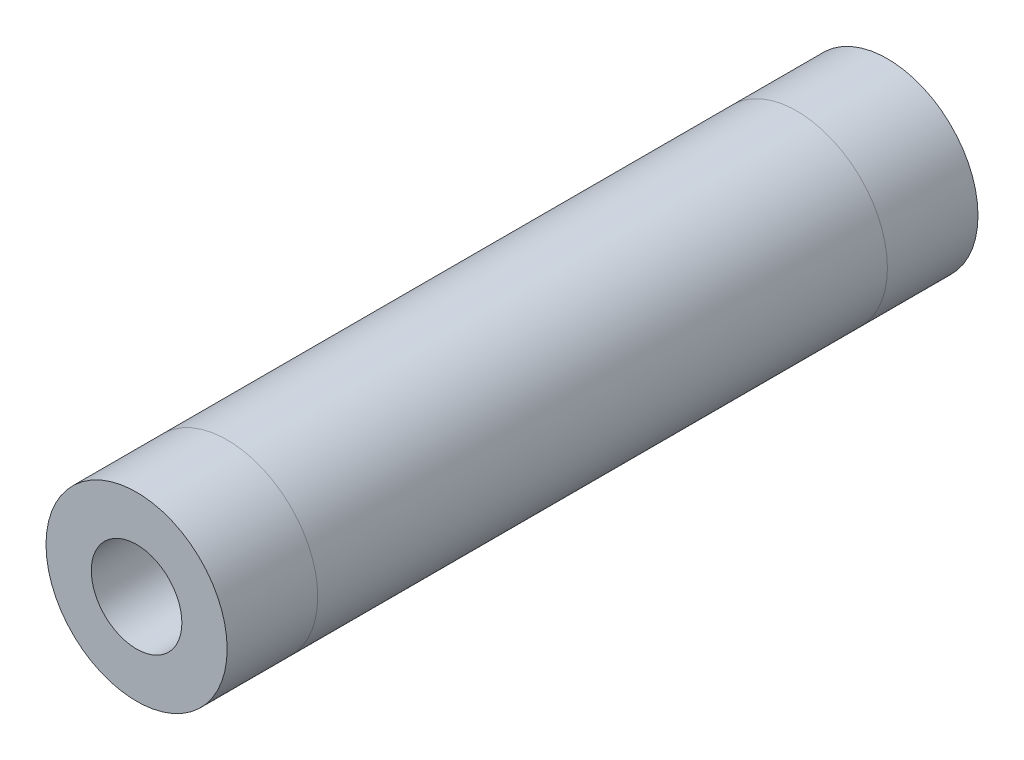
ISO-10303-21;
HEADER;
FILE_DESCRIPTION(('STEP AP214'),'2;1');
FILE_NAME('part.step','',(''),(''),'','','');
FILE_SCHEMA(('AUTOMOTIVE_DESIGN { 1 0 10303 214 1 1 1 1 }'));
ENDSEC;
DATA;
#1=APPLICATION_CONTEXT('core data for automotive mechanical design processes');
#2=APPLICATION_PROTOCOL_DEFINITION('international standard','automotive_design',2000,#1);
#3=PRODUCT_CONTEXT('',#1,'mechanical');
#4=PRODUCT('Part','Part','',(#3));
#5=PRODUCT_RELATED_PRODUCT_CATEGORY('part','',(#4));
#6=PRODUCT_DEFINITION_FORMATION('','',#4);
#7=PRODUCT_DEFINITION_CONTEXT('part definition',#1,'design');
#8=PRODUCT_DEFINITION('design','',#6,#7);
#9=PRODUCT_DEFINITION_SHAPE('','',#8);
#10=(LENGTH_UNIT() NAMED_UNIT(*) SI_UNIT(.MILLI.,.METRE.));
#11=(NAMED_UNIT(*) PLANE_ANGLE_UNIT() SI_UNIT($,.RADIAN.));
#12=(NAMED_UNIT(*) SI_UNIT($,.STERADIAN.) SOLID_ANGLE_UNIT());
#13=UNCERTAINTY_MEASURE_WITH_UNIT(LENGTH_MEASURE(1.E-05),#10,'distance_accuracy_value','');
#14=(GEOMETRIC_REPRESENTATION_CONTEXT(3) GLOBAL_UNCERTAINTY_ASSIGNED_CONTEXT((#13)) GLOBAL_UNIT_ASSIGNED_CONTEXT((#10,
#11,#12)) REPRESENTATION_CONTEXT('',''));
#15=CARTESIAN_POINT('',(0.,0.,0.));
#16=DIRECTION('',(0.,0.,1.));
#17=DIRECTION('',(1.,0.,0.));
#18=AXIS2_PLACEMENT_3D('',#15,#16,#17);
#19=CARTESIAN_POINT('',(0.,0.,-86.1562384361383));
#20=DIRECTION('',(0.,0.,1.));
#21=DIRECTION('',(1.,0.,0.));
#22=AXIS2_PLACEMENT_3D('',#19,#20,#21);
#23=CYLINDRICAL_SURFACE('',#22,6.35);
#24=CARTESIAN_POINT('',(0.,0.,-68.195726194));
#25=DIRECTION('',(0.,0.,1.));
#26=DIRECTION('',(1.,0.,0.));
#27=AXIS2_PLACEMENT_3D('',#24,#25,#26);
#28=CIRCLE('',#27,6.35);
#29=CARTESIAN_POINT('',(6.35,0.,-68.195726194));
#30=VERTEX_POINT('',#29);
#31=EDGE_CURVE('E12',#30,#30,#28,.F.);
#32=ORIENTED_EDGE('',*,*,#31,.F.);
#33=EDGE_LOOP('',(#32));
#34=FACE_BOUND('',#33,.T.);
#35=CARTESIAN_POINT('',(0.,0.,-28.2575));
#36=DIRECTION('',(0.,0.,1.));
#37=DIRECTION('',(1.,0.,0.));
#38=AXIS2_PLACEMENT_3D('',#35,#36,#37);
#39=CIRCLE('',#38,6.35);
#40=CARTESIAN_POINT('',(6.35,0.,-28.2575));
#41=VERTEX_POINT('',#40);
#42=EDGE_CURVE('E87',#41,#41,#39,.T.);
#43=ORIENTED_EDGE('',*,*,#42,.F.);
#44=EDGE_LOOP('',(#43));
#45=FACE_BOUND('',#44,.T.);
#46=ADVANCED_FACE('F74',(#34,#45),#23,.T.);
#47=CARTESIAN_POINT('',(0.,0.,-28.2575));
#48=DIRECTION('',(0.,0.,1.));
#49=DIRECTION('',(1.,0.,0.));
#50=AXIS2_PLACEMENT_3D('',#47,#48,#49);
#51=PLANE('',#50);
#52=CARTESIAN_POINT('',(0.,0.,-28.2575));
#53=DIRECTION('',(0.,0.,1.));
#54=DIRECTION('',(1.,0.,0.));
#55=AXIS2_PLACEMENT_3D('',#52,#53,#54);
#56=CIRCLE('',#55,4.7625);
#57=CARTESIAN_POINT('',(4.7625,0.,-28.2575));
#58=VERTEX_POINT('',#57);
#59=EDGE_CURVE('E89',#58,#58,#56,.T.);
#60=ORIENTED_EDGE('',*,*,#59,.F.);
#61=EDGE_LOOP('',(#60));
#62=FACE_BOUND('',#61,.T.);
#63=ORIENTED_EDGE('',*,*,#42,.T.);
#64=EDGE_LOOP('',(#63));
#65=FACE_BOUND('',#64,.T.);
#66=ADVANCED_FACE('F96',(#62,#65),#51,.T.);
#67=CARTESIAN_POINT('',(0.,0.,-86.1562384361383));
#68=DIRECTION('',(0.,0.,1.));
#69=DIRECTION('',(1.,0.,0.));
#70=AXIS2_PLACEMENT_3D('',#67,#68,#69);
#71=CYLINDRICAL_SURFACE('',#70,4.7625);
#72=CARTESIAN_POINT('',(0.,0.,-68.195726194));
#73=DIRECTION('',(0.,0.,1.));
#74=DIRECTION('',(1.,0.,0.));
#75=AXIS2_PLACEMENT_3D('',#72,#73,#74);
#76=CIRCLE('',#75,4.7625);
#77=CARTESIAN_POINT('',(4.7625,0.,-68.195726194));
#78=VERTEX_POINT('',#77);
#79=EDGE_CURVE('E77',#78,#78,#76,.F.);
#80=ORIENTED_EDGE('',*,*,#79,.T.);
#81=EDGE_LOOP('',(#80));
#82=FACE_BOUND('',#81,.T.);
#83=ORIENTED_EDGE('',*,*,#59,.T.);
#84=EDGE_LOOP('',(#83));
#85=FACE_BOUND('',#84,.T.);
#86=ADVANCED_FACE('F103',(#82,#85),#71,.F.);
#87=CARTESIAN_POINT('',(0.,0.,-68.195726194));
#88=DIRECTION('',(0.,0.,1.));
#89=DIRECTION('',(1.,0.,0.));
#90=AXIS2_PLACEMENT_3D('',#87,#88,#89);
#91=PLANE('',#90);
#92=ORIENTED_EDGE('',*,*,#31,.T.);
#93=EDGE_LOOP('',(#92));
#94=FACE_BOUND('',#93,.T.);
#95=ORIENTED_EDGE('',*,*,#79,.F.);
#96=EDGE_LOOP('',(#95));
#97=FACE_BOUND('',#96,.T.);
#98=ADVANCED_FACE('F108',(#94,#97),#91,.F.);
#99=CLOSED_SHELL('',(#46,#66,#86,#98));
#100=MANIFOLD_SOLID_BREP('B2',#99);
#101=CARTESIAN_POINT('',(0.,0.,-68.195726194));
#102=DIRECTION('',(0.,0.,1.));
#103=DIRECTION('',(1.,0.,0.));
#104=AXIS2_PLACEMENT_3D('',#101,#102,#103);
#105=PLANE('',#104);
#106=CARTESIAN_POINT('',(0.,0.,-68.195726194));
#107=DIRECTION('',(0.,0.,1.));
#108=DIRECTION('',(1.,0.,0.));
#109=AXIS2_PLACEMENT_3D('',#106,#107,#108);
#110=CIRCLE('',#109,6.35);
#111=CARTESIAN_POINT('',(6.35,0.,-68.195726194));
#112=VERTEX_POINT('',#111);
#113=EDGE_CURVE('E73',#112,#112,#110,.T.);
#114=ORIENTED_EDGE('',*,*,#113,.T.);
#115=EDGE_LOOP('',(#114));
#116=FACE_BOUND('',#115,.T.);
#117=CARTESIAN_POINT('',(0.,0.,-68.195726194));
#118=DIRECTION('',(0.,0.,1.));
#119=DIRECTION('',(1.,0.,0.));
#120=AXIS2_PLACEMENT_3D('',#117,#118,#119);
#121=CIRCLE('',#120,4.7625);
#122=CARTESIAN_POINT('',(4.7625,0.,-68.195726194));
#123=VERTEX_POINT('',#122);
#124=EDGE_CURVE('E161',#123,#123,#121,.T.);
#125=ORIENTED_EDGE('',*,*,#124,.F.);
#126=EDGE_LOOP('',(#125));
#127=FACE_BOUND('',#126,.T.);
#128=ADVANCED_FACE('F147',(#116,#127),#105,.T.);
#129=CARTESIAN_POINT('',(0.,0.,-68.195726194));
#130=DIRECTION('',(0.,0.,-1.));
#131=DIRECTION('',(-1.,0.,0.));
#132=AXIS2_PLACEMENT_3D('',#129,#130,#131);
#133=CYLINDRICAL_SURFACE('',#132,6.35);
#134=ORIENTED_EDGE('',*,*,#113,.F.);
#135=EDGE_LOOP('',(#134));
#136=FACE_BOUND('',#135,.T.);
#137=CARTESIAN_POINT('',(0.,0.,-74.545726194));
#138=DIRECTION('',(0.,0.,1.));
#139=DIRECTION('',(1.,0.,0.));
#140=AXIS2_PLACEMENT_3D('',#137,#138,#139);
#141=CIRCLE('',#140,6.35);
#142=CARTESIAN_POINT('',(6.35,0.,-74.545726194));
#143=VERTEX_POINT('',#142);
#144=EDGE_CURVE('E159',#143,#143,#141,.T.);
#145=ORIENTED_EDGE('',*,*,#144,.T.);
#146=EDGE_LOOP('',(#145));
#147=FACE_BOUND('',#146,.T.);
#148=ADVANCED_FACE('F149',(#136,#147),#133,.T.);
#149=CARTESIAN_POINT('',(0.,0.,-68.195726194));
#150=DIRECTION('',(0.,0.,-1.));
#151=DIRECTION('',(-1.,0.,0.));
#152=AXIS2_PLACEMENT_3D('',#149,#150,#151);
#153=CYLINDRICAL_SURFACE('',#152,3.175);
#154=CARTESIAN_POINT('',(0.,0.,-74.545726194));
#155=DIRECTION('',(0.,0.,1.));
#156=DIRECTION('',(1.,0.,0.));
#157=AXIS2_PLACEMENT_3D('',#154,#155,#156);
#158=CIRCLE('',#157,3.175);
#159=CARTESIAN_POINT('',(3.175,0.,-74.545726194));
#160=VERTEX_POINT('',#159);
#161=EDGE_CURVE('E151',#160,#160,#158,.T.);
#162=ORIENTED_EDGE('',*,*,#161,.F.);
#163=EDGE_LOOP('',(#162));
#164=FACE_BOUND('',#163,.T.);
#165=CARTESIAN_POINT('',(0.,0.,-61.845726194));
#166=DIRECTION('',(0.,0.,1.));
#167=DIRECTION('',(1.,0.,0.));
#168=AXIS2_PLACEMENT_3D('',#165,#166,#167);
#169=CIRCLE('',#168,3.175);
#170=CARTESIAN_POINT('',(3.175,0.,-61.845726194));
#171=VERTEX_POINT('',#170);
#172=EDGE_CURVE('E171',#171,#171,#169,.T.);
#173=ORIENTED_EDGE('',*,*,#172,.T.);
#174=EDGE_LOOP('',(#173));
#175=FACE_BOUND('',#174,.T.);
#176=ADVANCED_FACE('F176',(#164,#175),#153,.F.);
#177=CARTESIAN_POINT('',(0.,0.,-74.545726194));
#178=DIRECTION('',(0.,0.,1.));
#179=DIRECTION('',(1.,0.,0.));
#180=AXIS2_PLACEMENT_3D('',#177,#178,#179);
#181=PLANE('',#180);
#182=ORIENTED_EDGE('',*,*,#144,.F.);
#183=EDGE_LOOP('',(#182));
#184=FACE_BOUND('',#183,.T.);
#185=ORIENTED_EDGE('',*,*,#161,.T.);
#186=EDGE_LOOP('',(#185));
#187=FACE_BOUND('',#186,.T.);
#188=ADVANCED_FACE('F181',(#184,#187),#181,.F.);
#189=CARTESIAN_POINT('',(0.,0.,-61.845726194));
#190=DIRECTION('',(0.,0.,1.));
#191=DIRECTION('',(1.,0.,0.));
#192=AXIS2_PLACEMENT_3D('',#189,#190,#191);
#193=PLANE('',#192);
#194=CARTESIAN_POINT('',(0.,0.,-61.845726194));
#195=DIRECTION('',(0.,0.,1.));
#196=DIRECTION('',(1.,0.,0.));
#197=AXIS2_PLACEMENT_3D('',#194,#195,#196);
#198=CIRCLE('',#197,4.7625);
#199=CARTESIAN_POINT('',(4.7625,0.,-61.845726194));
#200=VERTEX_POINT('',#199);
#201=EDGE_CURVE('E164',#200,#200,#198,.T.);
#202=ORIENTED_EDGE('',*,*,#201,.T.);
#203=EDGE_LOOP('',(#202));
#204=FACE_BOUND('',#203,.T.);
#205=ORIENTED_EDGE('',*,*,#172,.F.);
#206=EDGE_LOOP('',(#205));
#207=FACE_BOUND('',#206,.T.);
#208=ADVANCED_FACE('F178',(#204,#207),#193,.T.);
#209=CARTESIAN_POINT('',(0.,0.,-61.845726194));
#210=DIRECTION('',(0.,0.,-1.));
#211=DIRECTION('',(-1.,0.,0.));
#212=AXIS2_PLACEMENT_3D('',#209,#210,#211);
#213=CYLINDRICAL_SURFACE('',#212,4.7625);
#214=ORIENTED_EDGE('',*,*,#201,.F.);
#215=EDGE_LOOP('',(#214));
#216=FACE_BOUND('',#215,.T.);
#217=ORIENTED_EDGE('',*,*,#124,.T.);
#218=EDGE_LOOP('',(#217));
#219=FACE_BOUND('',#218,.T.);
#220=ADVANCED_FACE('F180',(#216,#219),#213,.T.);
#221=CLOSED_SHELL('',(#128,#148,#176,#188,#208,#220));
#222=MANIFOLD_SOLID_BREP('B7',#221);
#223=CARTESIAN_POINT('',(0.,0.,-28.2575));
#224=DIRECTION('',(0.,0.,1.));
#225=DIRECTION('',(1.,0.,0.));
#226=AXIS2_PLACEMENT_3D('',#223,#224,#225);
#227=CYLINDRICAL_SURFACE('',#226,6.35);
#228=CARTESIAN_POINT('',(0.,0.,-28.2575));
#229=DIRECTION('',(0.,0.,1.));
#230=DIRECTION('',(1.,0.,0.));
#231=AXIS2_PLACEMENT_3D('',#228,#229,#230);
#232=CIRCLE('',#231,6.35);
#233=CARTESIAN_POINT('',(6.35,0.,-28.2575));
#234=VERTEX_POINT('',#233);
#235=EDGE_CURVE('E146',#234,#234,#232,.T.);
#236=ORIENTED_EDGE('',*,*,#235,.T.);
#237=EDGE_LOOP('',(#236));
#238=FACE_BOUND('',#237,.T.);
#239=CARTESIAN_POINT('',(0.,0.,-21.9075));
#240=DIRECTION('',(0.,0.,1.));
#241=DIRECTION('',(1.,0.,0.));
#242=AXIS2_PLACEMENT_3D('',#239,#240,#241);
#243=CIRCLE('',#242,6.35);
#244=CARTESIAN_POINT('',(6.35,0.,-21.9075));
#245=VERTEX_POINT('',#244);
#246=EDGE_CURVE('E259',#245,#245,#243,.T.);
#247=ORIENTED_EDGE('',*,*,#246,.F.);
#248=EDGE_LOOP('',(#247));
#249=FACE_BOUND('',#248,.T.);
#250=ADVANCED_FACE('F248',(#238,#249),#227,.T.);
#251=CARTESIAN_POINT('',(0.,0.,-28.2575));
#252=DIRECTION('',(0.,0.,1.));
#253=DIRECTION('',(1.,0.,0.));
#254=AXIS2_PLACEMENT_3D('',#251,#252,#253);
#255=CYLINDRICAL_SURFACE('',#254,3.175);
#256=CARTESIAN_POINT('',(0.,0.,-21.9075));
#257=DIRECTION('',(0.,0.,1.));
#258=DIRECTION('',(1.,0.,0.));
#259=AXIS2_PLACEMENT_3D('',#256,#257,#258);
#260=CIRCLE('',#259,3.175);
#261=CARTESIAN_POINT('',(3.175,0.,-21.9075));
#262=VERTEX_POINT('',#261);
#263=EDGE_CURVE('E251',#262,#262,#260,.T.);
#264=ORIENTED_EDGE('',*,*,#263,.T.);
#265=EDGE_LOOP('',(#264));
#266=FACE_BOUND('',#265,.T.);
#267=CARTESIAN_POINT('',(0.,0.,-34.6075));
#268=DIRECTION('',(0.,0.,1.));
#269=DIRECTION('',(1.,0.,0.));
#270=AXIS2_PLACEMENT_3D('',#267,#268,#269);
#271=CIRCLE('',#270,3.175);
#272=CARTESIAN_POINT('',(3.175,0.,-34.6075));
#273=VERTEX_POINT('',#272);
#274=EDGE_CURVE('E271',#273,#273,#271,.T.);
#275=ORIENTED_EDGE('',*,*,#274,.F.);
#276=EDGE_LOOP('',(#275));
#277=FACE_BOUND('',#276,.T.);
#278=ADVANCED_FACE('F279',(#266,#277),#255,.F.);
#279=CARTESIAN_POINT('',(0.,0.,-28.2575));
#280=DIRECTION('',(0.,0.,1.));
#281=DIRECTION('',(1.,0.,0.));
#282=AXIS2_PLACEMENT_3D('',#279,#280,#281);
#283=PLANE('',#282);
#284=CARTESIAN_POINT('',(0.,0.,-28.2575));
#285=DIRECTION('',(0.,0.,1.));
#286=DIRECTION('',(1.,0.,0.));
#287=AXIS2_PLACEMENT_3D('',#284,#285,#286);
#288=CIRCLE('',#287,4.7625);
#289=CARTESIAN_POINT('',(4.7625,0.,-28.2575));
#290=VERTEX_POINT('',#289);
#291=EDGE_CURVE('E261',#290,#290,#288,.T.);
#292=ORIENTED_EDGE('',*,*,#291,.T.);
#293=EDGE_LOOP('',(#292));
#294=FACE_BOUND('',#293,.T.);
#295=ORIENTED_EDGE('',*,*,#235,.F.);
#296=EDGE_LOOP('',(#295));
#297=FACE_BOUND('',#296,.T.);
#298=ADVANCED_FACE('F281',(#294,#297),#283,.F.);
#299=CARTESIAN_POINT('',(0.,0.,-21.9075));
#300=DIRECTION('',(0.,0.,1.));
#301=DIRECTION('',(1.,0.,0.));
#302=AXIS2_PLACEMENT_3D('',#299,#300,#301);
#303=PLANE('',#302);
#304=ORIENTED_EDGE('',*,*,#246,.T.);
#305=EDGE_LOOP('',(#304));
#306=FACE_BOUND('',#305,.T.);
#307=ORIENTED_EDGE('',*,*,#263,.F.);
#308=EDGE_LOOP('',(#307));
#309=FACE_BOUND('',#308,.T.);
#310=ADVANCED_FACE('F287',(#306,#309),#303,.T.);
#311=CARTESIAN_POINT('',(0.,0.,-34.6075));
#312=DIRECTION('',(0.,0.,1.));
#313=DIRECTION('',(1.,0.,0.));
#314=AXIS2_PLACEMENT_3D('',#311,#312,#313);
#315=CYLINDRICAL_SURFACE('',#314,4.7625);
#316=CARTESIAN_POINT('',(0.,0.,-34.6075));
#317=DIRECTION('',(0.,0.,1.));
#318=DIRECTION('',(1.,0.,0.));
#319=AXIS2_PLACEMENT_3D('',#316,#317,#318);
#320=CIRCLE('',#319,4.7625);
#321=CARTESIAN_POINT('',(4.7625,0.,-34.6075));
#322=VERTEX_POINT('',#321);
#323=EDGE_CURVE('E264',#322,#322,#320,.T.);
#324=ORIENTED_EDGE('',*,*,#323,.T.);
#325=EDGE_LOOP('',(#324));
#326=FACE_BOUND('',#325,.T.);
#327=ORIENTED_EDGE('',*,*,#291,.F.);
#328=EDGE_LOOP('',(#327));
#329=FACE_BOUND('',#328,.T.);
#330=ADVANCED_FACE('F292',(#326,#329),#315,.T.);
#331=CARTESIAN_POINT('',(0.,0.,-34.6075));
#332=DIRECTION('',(0.,0.,1.));
#333=DIRECTION('',(1.,0.,0.));
#334=AXIS2_PLACEMENT_3D('',#331,#332,#333);
#335=PLANE('',#334);
#336=ORIENTED_EDGE('',*,*,#274,.T.);
#337=EDGE_LOOP('',(#336));
#338=FACE_BOUND('',#337,.T.);
#339=ORIENTED_EDGE('',*,*,#323,.F.);
#340=EDGE_LOOP('',(#339));
#341=FACE_BOUND('',#340,.T.);
#342=ADVANCED_FACE('F276',(#338,#341),#335,.F.);
#343=CLOSED_SHELL('',(#250,#278,#298,#310,#330,#342));
#344=MANIFOLD_SOLID_BREP('B68',#343);
#345=ADVANCED_BREP_SHAPE_REPRESENTATION('',(#18,#100,#222,#344),#14);
#346=SHAPE_DEFINITION_REPRESENTATION(#9,#345);
ENDSEC;
END-ISO-10303-21;
